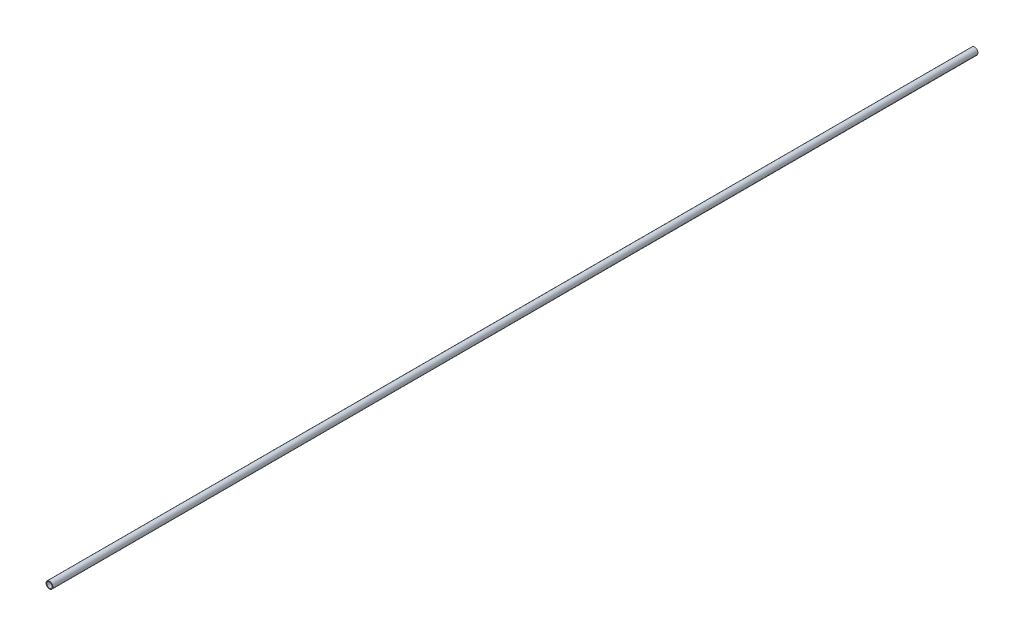
ISO-10303-21;
HEADER;
FILE_DESCRIPTION(('STEP AP214'),'2;1');
FILE_NAME('part.step','',(''),(''),'','','');
FILE_SCHEMA(('AUTOMOTIVE_DESIGN { 1 0 10303 214 1 1 1 1 }'));
ENDSEC;
DATA;
#1=APPLICATION_CONTEXT('core data for automotive mechanical design processes');
#2=APPLICATION_PROTOCOL_DEFINITION('international standard','automotive_design',2000,#1);
#3=PRODUCT_CONTEXT('',#1,'mechanical');
#4=PRODUCT('Part','Part','',(#3));
#5=PRODUCT_RELATED_PRODUCT_CATEGORY('part','',(#4));
#6=PRODUCT_DEFINITION_FORMATION('','',#4);
#7=PRODUCT_DEFINITION_CONTEXT('part definition',#1,'design');
#8=PRODUCT_DEFINITION('design','',#6,#7);
#9=PRODUCT_DEFINITION_SHAPE('','',#8);
#10=(LENGTH_UNIT() NAMED_UNIT(*) SI_UNIT(.MILLI.,.METRE.));
#11=(NAMED_UNIT(*) PLANE_ANGLE_UNIT() SI_UNIT($,.RADIAN.));
#12=(NAMED_UNIT(*) SI_UNIT($,.STERADIAN.) SOLID_ANGLE_UNIT());
#13=UNCERTAINTY_MEASURE_WITH_UNIT(LENGTH_MEASURE(1.E-05),#10,'distance_accuracy_value','');
#14=(GEOMETRIC_REPRESENTATION_CONTEXT(3) GLOBAL_UNCERTAINTY_ASSIGNED_CONTEXT((#13)) GLOBAL_UNIT_ASSIGNED_CONTEXT((#10,
#11,#12)) REPRESENTATION_CONTEXT('',''));
#15=CARTESIAN_POINT('',(0.,0.,0.));
#16=DIRECTION('',(0.,0.,1.));
#17=DIRECTION('',(1.,0.,0.));
#18=AXIS2_PLACEMENT_3D('',#15,#16,#17);
#19=CARTESIAN_POINT('',(0.,0.,1350.));
#20=DIRECTION('',(0.,0.,1.));
#21=DIRECTION('',(1.,0.,0.));
#22=AXIS2_PLACEMENT_3D('',#19,#20,#21);
#23=PLANE('',#22);
#24=CARTESIAN_POINT('',(0.,0.,1350.));
#25=DIRECTION('',(0.,0.,1.));
#26=DIRECTION('',(1.,0.,0.));
#27=AXIS2_PLACEMENT_3D('',#24,#25,#26);
#28=CIRCLE('',#27,5.);
#29=CARTESIAN_POINT('',(5.,0.,1350.));
#30=VERTEX_POINT('',#29);
#31=EDGE_CURVE('E10',#30,#30,#28,.T.);
#32=ORIENTED_EDGE('',*,*,#31,.T.);
#33=EDGE_LOOP('',(#32));
#34=FACE_BOUND('',#33,.T.);
#35=CARTESIAN_POINT('',(0.,0.,1350.));
#36=DIRECTION('',(0.,0.,1.));
#37=DIRECTION('',(1.,0.,0.));
#38=AXIS2_PLACEMENT_3D('',#35,#36,#37);
#39=CIRCLE('',#38,4.);
#40=CARTESIAN_POINT('',(4.,0.,1350.));
#41=VERTEX_POINT('',#40);
#42=EDGE_CURVE('E41',#41,#41,#39,.T.);
#43=ORIENTED_EDGE('',*,*,#42,.F.);
#44=EDGE_LOOP('',(#43));
#45=FACE_BOUND('',#44,.T.);
#46=ADVANCED_FACE('F30',(#34,#45),#23,.T.);
#47=CARTESIAN_POINT('',(0.,0.,0.));
#48=DIRECTION('',(0.,0.,1.));
#49=DIRECTION('',(1.,0.,0.));
#50=AXIS2_PLACEMENT_3D('',#47,#48,#49);
#51=PLANE('',#50);
#52=CARTESIAN_POINT('',(0.,0.,0.));
#53=DIRECTION('',(0.,0.,1.));
#54=DIRECTION('',(1.,0.,0.));
#55=AXIS2_PLACEMENT_3D('',#52,#53,#54);
#56=CIRCLE('',#55,5.);
#57=CARTESIAN_POINT('',(5.,0.,0.));
#58=VERTEX_POINT('',#57);
#59=EDGE_CURVE('E34',#58,#58,#56,.T.);
#60=ORIENTED_EDGE('',*,*,#59,.F.);
#61=EDGE_LOOP('',(#60));
#62=FACE_BOUND('',#61,.T.);
#63=CARTESIAN_POINT('',(0.,0.,0.));
#64=DIRECTION('',(0.,0.,1.));
#65=DIRECTION('',(1.,0.,0.));
#66=AXIS2_PLACEMENT_3D('',#63,#64,#65);
#67=CIRCLE('',#66,4.);
#68=CARTESIAN_POINT('',(4.,0.,0.));
#69=VERTEX_POINT('',#68);
#70=EDGE_CURVE('E43',#69,#69,#67,.T.);
#71=ORIENTED_EDGE('',*,*,#70,.T.);
#72=EDGE_LOOP('',(#71));
#73=FACE_BOUND('',#72,.T.);
#74=ADVANCED_FACE('F53',(#62,#73),#51,.F.);
#75=CARTESIAN_POINT('',(0.,0.,1350.));
#76=DIRECTION('',(0.,0.,-1.));
#77=DIRECTION('',(-1.,0.,0.));
#78=AXIS2_PLACEMENT_3D('',#75,#76,#77);
#79=CYLINDRICAL_SURFACE('',#78,5.);
#80=ORIENTED_EDGE('',*,*,#31,.F.);
#81=EDGE_LOOP('',(#80));
#82=FACE_BOUND('',#81,.T.);
#83=ORIENTED_EDGE('',*,*,#59,.T.);
#84=EDGE_LOOP('',(#83));
#85=FACE_BOUND('',#84,.T.);
#86=ADVANCED_FACE('F32',(#82,#85),#79,.T.);
#87=CARTESIAN_POINT('',(0.,0.,1350.));
#88=DIRECTION('',(0.,0.,-1.));
#89=DIRECTION('',(-1.,0.,0.));
#90=AXIS2_PLACEMENT_3D('',#87,#88,#89);
#91=CYLINDRICAL_SURFACE('',#90,4.);
#92=ORIENTED_EDGE('',*,*,#42,.T.);
#93=EDGE_LOOP('',(#92));
#94=FACE_BOUND('',#93,.T.);
#95=ORIENTED_EDGE('',*,*,#70,.F.);
#96=EDGE_LOOP('',(#95));
#97=FACE_BOUND('',#96,.T.);
#98=ADVANCED_FACE('F49',(#94,#97),#91,.F.);
#99=CLOSED_SHELL('',(#46,#74,#86,#98));
#100=MANIFOLD_SOLID_BREP('B2',#99);
#101=ADVANCED_BREP_SHAPE_REPRESENTATION('',(#18,#100),#14);
#102=SHAPE_DEFINITION_REPRESENTATION(#9,#101);
ENDSEC;
END-ISO-10303-21;
